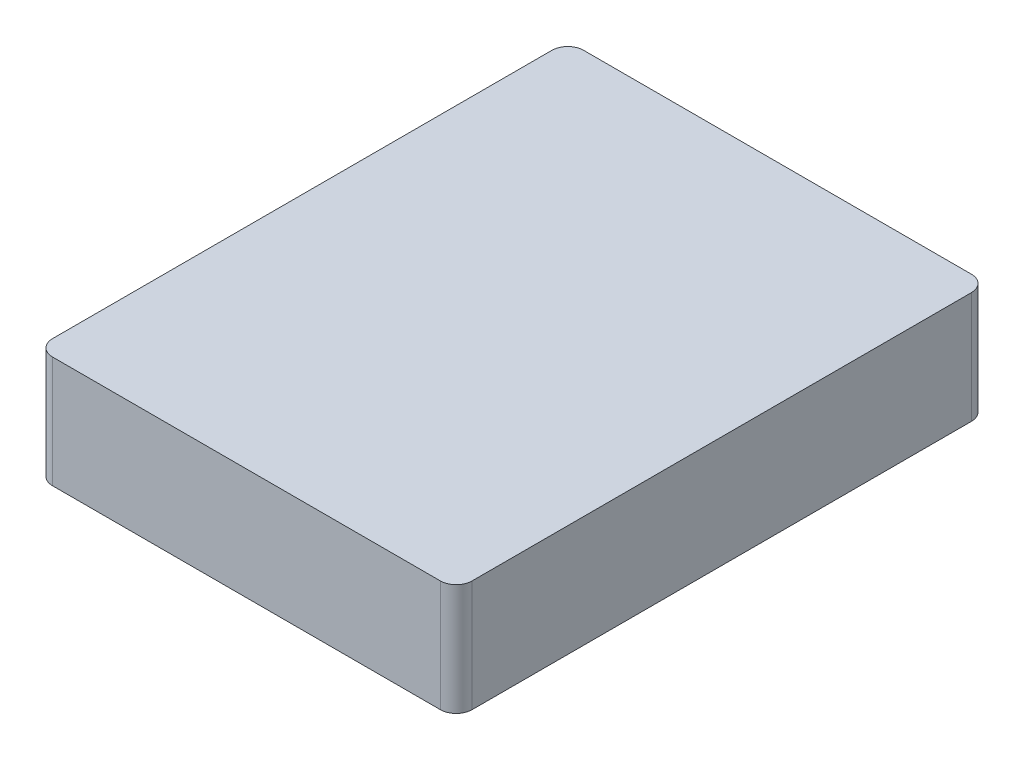
ISO-10303-21;
HEADER;
FILE_DESCRIPTION(('STEP AP214'),'2;1');
FILE_NAME('part.step','',(''),(''),'','','');
FILE_SCHEMA(('AUTOMOTIVE_DESIGN { 1 0 10303 214 1 1 1 1 }'));
ENDSEC;
DATA;
#1=APPLICATION_CONTEXT('core data for automotive mechanical design processes');
#2=APPLICATION_PROTOCOL_DEFINITION('international standard','automotive_design',2000,#1);
#3=PRODUCT_CONTEXT('',#1,'mechanical');
#4=PRODUCT('Part','Part','',(#3));
#5=PRODUCT_RELATED_PRODUCT_CATEGORY('part','',(#4));
#6=PRODUCT_DEFINITION_FORMATION('','',#4);
#7=PRODUCT_DEFINITION_CONTEXT('part definition',#1,'design');
#8=PRODUCT_DEFINITION('design','',#6,#7);
#9=PRODUCT_DEFINITION_SHAPE('','',#8);
#10=(LENGTH_UNIT() NAMED_UNIT(*) SI_UNIT(.MILLI.,.METRE.));
#11=(NAMED_UNIT(*) PLANE_ANGLE_UNIT() SI_UNIT($,.RADIAN.));
#12=(NAMED_UNIT(*) SI_UNIT($,.STERADIAN.) SOLID_ANGLE_UNIT());
#13=UNCERTAINTY_MEASURE_WITH_UNIT(LENGTH_MEASURE(1.E-05),#10,'distance_accuracy_value','');
#14=(GEOMETRIC_REPRESENTATION_CONTEXT(3) GLOBAL_UNCERTAINTY_ASSIGNED_CONTEXT((#13)) GLOBAL_UNIT_ASSIGNED_CONTEXT((#10,
#11,#12)) REPRESENTATION_CONTEXT('',''));
#15=CARTESIAN_POINT('',(0.,0.,0.));
#16=DIRECTION('',(0.,0.,1.));
#17=DIRECTION('',(1.,0.,0.));
#18=AXIS2_PLACEMENT_3D('',#15,#16,#17);
#19=CARTESIAN_POINT('',(-36.5,21.,47.));
#20=DIRECTION('',(0.,-1.,0.));
#21=DIRECTION('',(0.,0.,-1.));
#22=AXIS2_PLACEMENT_3D('',#19,#20,#21);
#23=CYLINDRICAL_SURFACE('',#22,3.);
#24=CARTESIAN_POINT('',(-36.5,0.,47.));
#25=DIRECTION('',(0.,1.,0.));
#26=DIRECTION('',(0.,0.,1.));
#27=AXIS2_PLACEMENT_3D('',#24,#25,#26);
#28=CIRCLE('',#27,3.);
#29=CARTESIAN_POINT('',(-39.5,0.,47.));
#30=VERTEX_POINT('',#29);
#31=CARTESIAN_POINT('',(-36.4999999999999,0.,50.));
#32=VERTEX_POINT('',#31);
#33=EDGE_CURVE('E137',#30,#32,#28,.T.);
#34=ORIENTED_EDGE('',*,*,#33,.T.);
#35=DIRECTION('',(0.,-1.,0.));
#36=VECTOR('',#35,1.);
#37=CARTESIAN_POINT('',(-36.4999999999999,21.,50.));
#38=LINE('',#37,#36);
#39=CARTESIAN_POINT('',(-36.4999999999999,21.,50.));
#40=VERTEX_POINT('',#39);
#41=EDGE_CURVE('E11',#40,#32,#38,.T.);
#42=ORIENTED_EDGE('',*,*,#41,.F.);
#43=CARTESIAN_POINT('',(-36.5,21.,47.));
#44=DIRECTION('',(0.,1.,0.));
#45=DIRECTION('',(0.,0.,1.));
#46=AXIS2_PLACEMENT_3D('',#43,#44,#45);
#47=CIRCLE('',#46,3.);
#48=CARTESIAN_POINT('',(-39.5,21.,47.));
#49=VERTEX_POINT('',#48);
#50=EDGE_CURVE('E154',#49,#40,#47,.T.);
#51=ORIENTED_EDGE('',*,*,#50,.F.);
#52=DIRECTION('',(0.,-1.,0.));
#53=VECTOR('',#52,1.);
#54=CARTESIAN_POINT('',(-39.5,21.,47.));
#55=LINE('',#54,#53);
#56=EDGE_CURVE('E134',#49,#30,#55,.T.);
#57=ORIENTED_EDGE('',*,*,#56,.T.);
#58=EDGE_LOOP('',(#34,#42,#51,#57));
#59=FACE_BOUND('',#58,.T.);
#60=ADVANCED_FACE('F43',(#59),#23,.T.);
#61=CARTESIAN_POINT('',(-36.4999999999999,21.,50.));
#62=DIRECTION('',(0.,0.,-1.));
#63=DIRECTION('',(-1.,0.,0.));
#64=AXIS2_PLACEMENT_3D('',#61,#62,#63);
#65=PLANE('',#64);
#66=DIRECTION('',(1.,0.,0.));
#67=VECTOR('',#66,1.);
#68=CARTESIAN_POINT('',(-36.4999999999999,0.,50.));
#69=LINE('',#68,#67);
#70=CARTESIAN_POINT('',(36.5,0.,50.));
#71=VERTEX_POINT('',#70);
#72=EDGE_CURVE('E145',#32,#71,#69,.T.);
#73=ORIENTED_EDGE('',*,*,#72,.T.);
#74=DIRECTION('',(0.,-1.,0.));
#75=VECTOR('',#74,1.);
#76=CARTESIAN_POINT('',(36.5,21.,50.));
#77=LINE('',#76,#75);
#78=CARTESIAN_POINT('',(36.5,21.,50.));
#79=VERTEX_POINT('',#78);
#80=EDGE_CURVE('E51',#79,#71,#77,.T.);
#81=ORIENTED_EDGE('',*,*,#80,.F.);
#82=DIRECTION('',(1.,0.,0.));
#83=VECTOR('',#82,1.);
#84=CARTESIAN_POINT('',(-36.4999999999999,21.,50.));
#85=LINE('',#84,#83);
#86=EDGE_CURVE('E105',#40,#79,#85,.T.);
#87=ORIENTED_EDGE('',*,*,#86,.F.);
#88=ORIENTED_EDGE('',*,*,#41,.T.);
#89=EDGE_LOOP('',(#73,#81,#87,#88));
#90=FACE_BOUND('',#89,.T.);
#91=ADVANCED_FACE('F187',(#90),#65,.F.);
#92=CARTESIAN_POINT('',(36.5,21.,47.));
#93=DIRECTION('',(0.,-1.,0.));
#94=DIRECTION('',(0.,0.,-1.));
#95=AXIS2_PLACEMENT_3D('',#92,#93,#94);
#96=CYLINDRICAL_SURFACE('',#95,3.);
#97=CARTESIAN_POINT('',(36.5,0.,47.));
#98=DIRECTION('',(0.,1.,0.));
#99=DIRECTION('',(0.,0.,1.));
#100=AXIS2_PLACEMENT_3D('',#97,#98,#99);
#101=CIRCLE('',#100,3.);
#102=CARTESIAN_POINT('',(39.5,0.,47.));
#103=VERTEX_POINT('',#102);
#104=EDGE_CURVE('E143',#71,#103,#101,.T.);
#105=ORIENTED_EDGE('',*,*,#104,.T.);
#106=DIRECTION('',(0.,-1.,0.));
#107=VECTOR('',#106,1.);
#108=CARTESIAN_POINT('',(39.5,21.,47.));
#109=LINE('',#108,#107);
#110=CARTESIAN_POINT('',(39.5,21.,47.));
#111=VERTEX_POINT('',#110);
#112=EDGE_CURVE('E158',#111,#103,#109,.T.);
#113=ORIENTED_EDGE('',*,*,#112,.F.);
#114=CARTESIAN_POINT('',(36.5,21.,47.));
#115=DIRECTION('',(0.,1.,0.));
#116=DIRECTION('',(0.,0.,1.));
#117=AXIS2_PLACEMENT_3D('',#114,#115,#116);
#118=CIRCLE('',#117,3.);
#119=EDGE_CURVE('E166',#79,#111,#118,.T.);
#120=ORIENTED_EDGE('',*,*,#119,.F.);
#121=ORIENTED_EDGE('',*,*,#80,.T.);
#122=EDGE_LOOP('',(#105,#113,#120,#121));
#123=FACE_BOUND('',#122,.T.);
#124=ADVANCED_FACE('F168',(#123),#96,.T.);
#125=CARTESIAN_POINT('',(39.5,21.,-47.));
#126=DIRECTION('',(-1.,0.,0.));
#127=DIRECTION('',(0.,0.,1.));
#128=AXIS2_PLACEMENT_3D('',#125,#126,#127);
#129=PLANE('',#128);
#130=DIRECTION('',(0.,0.,-1.));
#131=VECTOR('',#130,1.);
#132=CARTESIAN_POINT('',(39.5,0.,-47.));
#133=LINE('',#132,#131);
#134=CARTESIAN_POINT('',(39.5,0.,-47.));
#135=VERTEX_POINT('',#134);
#136=EDGE_CURVE('E147',#103,#135,#133,.T.);
#137=ORIENTED_EDGE('',*,*,#136,.T.);
#138=DIRECTION('',(0.,-1.,0.));
#139=VECTOR('',#138,1.);
#140=CARTESIAN_POINT('',(39.5,21.,-47.));
#141=LINE('',#140,#139);
#142=CARTESIAN_POINT('',(39.5,21.,-47.));
#143=VERTEX_POINT('',#142);
#144=EDGE_CURVE('E160',#143,#135,#141,.T.);
#145=ORIENTED_EDGE('',*,*,#144,.F.);
#146=DIRECTION('',(0.,0.,-1.));
#147=VECTOR('',#146,1.);
#148=CARTESIAN_POINT('',(39.5,21.,-47.));
#149=LINE('',#148,#147);
#150=EDGE_CURVE('E179',#111,#143,#149,.T.);
#151=ORIENTED_EDGE('',*,*,#150,.F.);
#152=ORIENTED_EDGE('',*,*,#112,.T.);
#153=EDGE_LOOP('',(#137,#145,#151,#152));
#154=FACE_BOUND('',#153,.T.);
#155=ADVANCED_FACE('F176',(#154),#129,.F.);
#156=CARTESIAN_POINT('',(36.5,21.,-47.));
#157=DIRECTION('',(0.,-1.,0.));
#158=DIRECTION('',(0.,0.,-1.));
#159=AXIS2_PLACEMENT_3D('',#156,#157,#158);
#160=CYLINDRICAL_SURFACE('',#159,3.);
#161=CARTESIAN_POINT('',(36.5,0.,-47.));
#162=DIRECTION('',(0.,1.,0.));
#163=DIRECTION('',(0.,0.,-1.));
#164=AXIS2_PLACEMENT_3D('',#161,#162,#163);
#165=CIRCLE('',#164,3.);
#166=CARTESIAN_POINT('',(36.5,0.,-50.));
#167=VERTEX_POINT('',#166);
#168=EDGE_CURVE('E149',#135,#167,#165,.T.);
#169=ORIENTED_EDGE('',*,*,#168,.T.);
#170=DIRECTION('',(0.,-1.,0.));
#171=VECTOR('',#170,1.);
#172=CARTESIAN_POINT('',(36.5,21.,-50.));
#173=LINE('',#172,#171);
#174=CARTESIAN_POINT('',(36.5,21.,-50.));
#175=VERTEX_POINT('',#174);
#176=EDGE_CURVE('E127',#175,#167,#173,.T.);
#177=ORIENTED_EDGE('',*,*,#176,.F.);
#178=CARTESIAN_POINT('',(36.5,21.,-47.));
#179=DIRECTION('',(0.,1.,0.));
#180=DIRECTION('',(0.,0.,-1.));
#181=AXIS2_PLACEMENT_3D('',#178,#179,#180);
#182=CIRCLE('',#181,3.);
#183=EDGE_CURVE('E123',#143,#175,#182,.T.);
#184=ORIENTED_EDGE('',*,*,#183,.F.);
#185=ORIENTED_EDGE('',*,*,#144,.T.);
#186=EDGE_LOOP('',(#169,#177,#184,#185));
#187=FACE_BOUND('',#186,.T.);
#188=ADVANCED_FACE('F177',(#187),#160,.T.);
#189=CARTESIAN_POINT('',(-36.5,21.,-50.));
#190=DIRECTION('',(0.,0.,1.));
#191=DIRECTION('',(1.,0.,0.));
#192=AXIS2_PLACEMENT_3D('',#189,#190,#191);
#193=PLANE('',#192);
#194=DIRECTION('',(-1.,0.,0.));
#195=VECTOR('',#194,1.);
#196=CARTESIAN_POINT('',(-36.5,0.,-50.));
#197=LINE('',#196,#195);
#198=CARTESIAN_POINT('',(-36.5,0.,-50.));
#199=VERTEX_POINT('',#198);
#200=EDGE_CURVE('E129',#167,#199,#197,.T.);
#201=ORIENTED_EDGE('',*,*,#200,.T.);
#202=DIRECTION('',(0.,-1.,0.));
#203=VECTOR('',#202,1.);
#204=CARTESIAN_POINT('',(-36.5,21.,-50.));
#205=LINE('',#204,#203);
#206=CARTESIAN_POINT('',(-36.5,21.,-50.));
#207=VERTEX_POINT('',#206);
#208=EDGE_CURVE('E128',#207,#199,#205,.T.);
#209=ORIENTED_EDGE('',*,*,#208,.F.);
#210=DIRECTION('',(-1.,0.,0.));
#211=VECTOR('',#210,1.);
#212=CARTESIAN_POINT('',(-36.5,21.,-50.));
#213=LINE('',#212,#211);
#214=EDGE_CURVE('E113',#175,#207,#213,.T.);
#215=ORIENTED_EDGE('',*,*,#214,.F.);
#216=ORIENTED_EDGE('',*,*,#176,.T.);
#217=EDGE_LOOP('',(#201,#209,#215,#216));
#218=FACE_BOUND('',#217,.T.);
#219=ADVANCED_FACE('F130',(#218),#193,.F.);
#220=CARTESIAN_POINT('',(-36.5,21.,-47.));
#221=DIRECTION('',(0.,-1.,0.));
#222=DIRECTION('',(0.,0.,-1.));
#223=AXIS2_PLACEMENT_3D('',#220,#221,#222);
#224=CYLINDRICAL_SURFACE('',#223,3.);
#225=CARTESIAN_POINT('',(-36.5,0.,-47.));
#226=DIRECTION('',(0.,1.,0.));
#227=DIRECTION('',(0.,0.,1.));
#228=AXIS2_PLACEMENT_3D('',#225,#226,#227);
#229=CIRCLE('',#228,3.);
#230=CARTESIAN_POINT('',(-39.5,0.,-47.));
#231=VERTEX_POINT('',#230);
#232=EDGE_CURVE('E88',#199,#231,#229,.T.);
#233=ORIENTED_EDGE('',*,*,#232,.T.);
#234=DIRECTION('',(0.,-1.,0.));
#235=VECTOR('',#234,1.);
#236=CARTESIAN_POINT('',(-39.5,21.,-47.));
#237=LINE('',#236,#235);
#238=CARTESIAN_POINT('',(-39.5,21.,-47.));
#239=VERTEX_POINT('',#238);
#240=EDGE_CURVE('E131',#239,#231,#237,.T.);
#241=ORIENTED_EDGE('',*,*,#240,.F.);
#242=CARTESIAN_POINT('',(-36.5,21.,-47.));
#243=DIRECTION('',(0.,1.,0.));
#244=DIRECTION('',(0.,0.,1.));
#245=AXIS2_PLACEMENT_3D('',#242,#243,#244);
#246=CIRCLE('',#245,3.);
#247=EDGE_CURVE('E118',#207,#239,#246,.T.);
#248=ORIENTED_EDGE('',*,*,#247,.F.);
#249=ORIENTED_EDGE('',*,*,#208,.T.);
#250=EDGE_LOOP('',(#233,#241,#248,#249));
#251=FACE_BOUND('',#250,.T.);
#252=ADVANCED_FACE('F133',(#251),#224,.T.);
#253=CARTESIAN_POINT('',(-39.5,21.,-47.));
#254=DIRECTION('',(1.,0.,0.));
#255=DIRECTION('',(0.,0.,-1.));
#256=AXIS2_PLACEMENT_3D('',#253,#254,#255);
#257=PLANE('',#256);
#258=DIRECTION('',(0.,0.,1.));
#259=VECTOR('',#258,1.);
#260=CARTESIAN_POINT('',(-39.5,0.,-47.));
#261=LINE('',#260,#259);
#262=EDGE_CURVE('E92',#231,#30,#261,.T.);
#263=ORIENTED_EDGE('',*,*,#262,.T.);
#264=ORIENTED_EDGE('',*,*,#56,.F.);
#265=DIRECTION('',(0.,0.,1.));
#266=VECTOR('',#265,1.);
#267=CARTESIAN_POINT('',(-39.5,21.,-47.));
#268=LINE('',#267,#266);
#269=EDGE_CURVE('E56',#239,#49,#268,.T.);
#270=ORIENTED_EDGE('',*,*,#269,.F.);
#271=ORIENTED_EDGE('',*,*,#240,.T.);
#272=EDGE_LOOP('',(#263,#264,#270,#271));
#273=FACE_BOUND('',#272,.T.);
#274=ADVANCED_FACE('F204',(#273),#257,.F.);
#275=CARTESIAN_POINT('',(-36.5,21.,47.));
#276=DIRECTION('',(0.,1.,0.));
#277=DIRECTION('',(0.,0.,1.));
#278=AXIS2_PLACEMENT_3D('',#275,#276,#277);
#279=PLANE('',#278);
#280=ORIENTED_EDGE('',*,*,#50,.T.);
#281=ORIENTED_EDGE('',*,*,#86,.T.);
#282=ORIENTED_EDGE('',*,*,#119,.T.);
#283=ORIENTED_EDGE('',*,*,#150,.T.);
#284=ORIENTED_EDGE('',*,*,#183,.T.);
#285=ORIENTED_EDGE('',*,*,#214,.T.);
#286=ORIENTED_EDGE('',*,*,#247,.T.);
#287=ORIENTED_EDGE('',*,*,#269,.T.);
#288=EDGE_LOOP('',(#280,#281,#282,#283,#284,#285,#286,#287));
#289=FACE_BOUND('',#288,.T.);
#290=ADVANCED_FACE('F117',(#289),#279,.T.);
#291=CARTESIAN_POINT('',(-36.5,0.,47.));
#292=DIRECTION('',(0.,1.,0.));
#293=DIRECTION('',(0.,0.,1.));
#294=AXIS2_PLACEMENT_3D('',#291,#292,#293);
#295=PLANE('',#294);
#296=ORIENTED_EDGE('',*,*,#33,.F.);
#297=ORIENTED_EDGE('',*,*,#262,.F.);
#298=ORIENTED_EDGE('',*,*,#232,.F.);
#299=ORIENTED_EDGE('',*,*,#200,.F.);
#300=ORIENTED_EDGE('',*,*,#168,.F.);
#301=ORIENTED_EDGE('',*,*,#136,.F.);
#302=ORIENTED_EDGE('',*,*,#104,.F.);
#303=ORIENTED_EDGE('',*,*,#72,.F.);
#304=EDGE_LOOP('',(#296,#297,#298,#299,#300,#301,#302,#303));
#305=FACE_BOUND('',#304,.T.);
#306=ADVANCED_FACE('F175',(#305),#295,.F.);
#307=CLOSED_SHELL('',(#60,#91,#124,#155,#188,#219,#252,#274,#290,#306));
#308=MANIFOLD_SOLID_BREP('B2',#307);
#309=ADVANCED_BREP_SHAPE_REPRESENTATION('',(#18,#308),#14);
#310=SHAPE_DEFINITION_REPRESENTATION(#9,#309);
ENDSEC;
END-ISO-10303-21;
